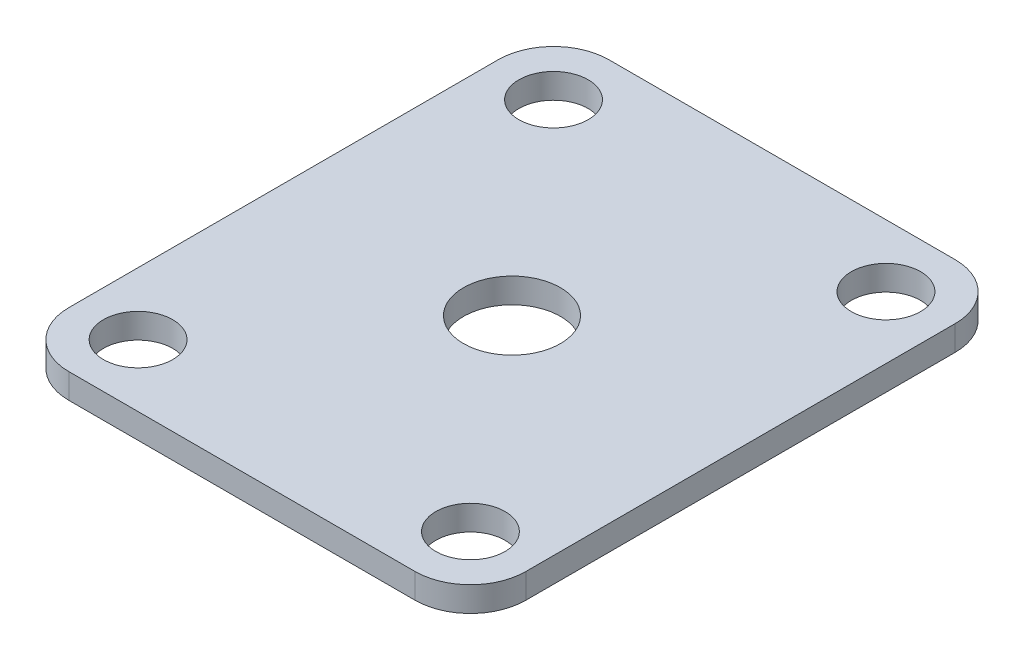
ISO-10303-21;
HEADER;
FILE_DESCRIPTION(('STEP AP214'),'2;1');
FILE_NAME('part.step','',(''),(''),'','','');
FILE_SCHEMA(('AUTOMOTIVE_DESIGN { 1 0 10303 214 1 1 1 1 }'));
ENDSEC;
DATA;
#1=APPLICATION_CONTEXT('core data for automotive mechanical design processes');
#2=APPLICATION_PROTOCOL_DEFINITION('international standard','automotive_design',2000,#1);
#3=PRODUCT_CONTEXT('',#1,'mechanical');
#4=PRODUCT('Part','Part','',(#3));
#5=PRODUCT_RELATED_PRODUCT_CATEGORY('part','',(#4));
#6=PRODUCT_DEFINITION_FORMATION('','',#4);
#7=PRODUCT_DEFINITION_CONTEXT('part definition',#1,'design');
#8=PRODUCT_DEFINITION('design','',#6,#7);
#9=PRODUCT_DEFINITION_SHAPE('','',#8);
#10=(LENGTH_UNIT() NAMED_UNIT(*) SI_UNIT(.MILLI.,.METRE.));
#11=(NAMED_UNIT(*) PLANE_ANGLE_UNIT() SI_UNIT($,.RADIAN.));
#12=(NAMED_UNIT(*) SI_UNIT($,.STERADIAN.) SOLID_ANGLE_UNIT());
#13=UNCERTAINTY_MEASURE_WITH_UNIT(LENGTH_MEASURE(1.E-05),#10,'distance_accuracy_value','');
#14=(GEOMETRIC_REPRESENTATION_CONTEXT(3) GLOBAL_UNCERTAINTY_ASSIGNED_CONTEXT((#13)) GLOBAL_UNIT_ASSIGNED_CONTEXT((#10,
#11,#12)) REPRESENTATION_CONTEXT('',''));
#15=CARTESIAN_POINT('',(0.,0.,0.));
#16=DIRECTION('',(0.,0.,1.));
#17=DIRECTION('',(1.,0.,0.));
#18=AXIS2_PLACEMENT_3D('',#15,#16,#17);
#19=CARTESIAN_POINT('',(0.,1.8,0.));
#20=DIRECTION('',(0.,1.,0.));
#21=DIRECTION('',(0.,0.,1.));
#22=AXIS2_PLACEMENT_3D('',#19,#20,#21);
#23=PLANE('',#22);
#24=CARTESIAN_POINT('',(-12.,1.8,-15.));
#25=DIRECTION('',(0.,1.,0.));
#26=DIRECTION('',(0.,0.,1.));
#27=AXIS2_PLACEMENT_3D('',#24,#25,#26);
#28=CIRCLE('',#27,2.5);
#29=CARTESIAN_POINT('',(-12.,1.8,-12.5));
#30=VERTEX_POINT('',#29);
#31=EDGE_CURVE('E192',#30,#30,#28,.T.);
#32=ORIENTED_EDGE('',*,*,#31,.F.);
#33=EDGE_LOOP('',(#32));
#34=FACE_BOUND('',#33,.T.);
#35=CARTESIAN_POINT('',(12.,1.8,-15.));
#36=DIRECTION('',(0.,1.,0.));
#37=DIRECTION('',(0.,0.,-1.));
#38=AXIS2_PLACEMENT_3D('',#35,#36,#37);
#39=CIRCLE('',#38,2.5);
#40=CARTESIAN_POINT('',(12.,1.8,-17.5));
#41=VERTEX_POINT('',#40);
#42=EDGE_CURVE('E181',#41,#41,#39,.T.);
#43=ORIENTED_EDGE('',*,*,#42,.F.);
#44=EDGE_LOOP('',(#43));
#45=FACE_BOUND('',#44,.T.);
#46=DIRECTION('',(0.,0.,1.));
#47=VECTOR('',#46,1.);
#48=CARTESIAN_POINT('',(-16.5,1.8,19.5));
#49=LINE('',#48,#47);
#50=CARTESIAN_POINT('',(-16.5,1.8,-15.5));
#51=VERTEX_POINT('',#50);
#52=CARTESIAN_POINT('',(-16.5,1.8,15.5));
#53=VERTEX_POINT('',#52);
#54=EDGE_CURVE('E109',#51,#53,#49,.T.);
#55=ORIENTED_EDGE('',*,*,#54,.T.);
#56=CARTESIAN_POINT('',(-12.5,1.8,15.5));
#57=DIRECTION('',(0.,1.,0.));
#58=DIRECTION('',(0.,0.,1.));
#59=AXIS2_PLACEMENT_3D('',#56,#57,#58);
#60=CIRCLE('',#59,4.);
#61=CARTESIAN_POINT('',(-12.5,1.8,19.5));
#62=VERTEX_POINT('',#61);
#63=EDGE_CURVE('E11',#53,#62,#60,.T.);
#64=ORIENTED_EDGE('',*,*,#63,.T.);
#65=DIRECTION('',(1.,0.,0.));
#66=VECTOR('',#65,1.);
#67=CARTESIAN_POINT('',(16.5,1.8,19.5));
#68=LINE('',#67,#66);
#69=CARTESIAN_POINT('',(12.5,1.8,19.5));
#70=VERTEX_POINT('',#69);
#71=EDGE_CURVE('E160',#62,#70,#68,.T.);
#72=ORIENTED_EDGE('',*,*,#71,.T.);
#73=CARTESIAN_POINT('',(12.5,1.8,15.5));
#74=DIRECTION('',(0.,1.,0.));
#75=DIRECTION('',(0.,0.,1.));
#76=AXIS2_PLACEMENT_3D('',#73,#74,#75);
#77=CIRCLE('',#76,4.);
#78=CARTESIAN_POINT('',(16.5,1.8,15.5));
#79=VERTEX_POINT('',#78);
#80=EDGE_CURVE('E151',#70,#79,#77,.T.);
#81=ORIENTED_EDGE('',*,*,#80,.T.);
#82=DIRECTION('',(0.,0.,-1.));
#83=VECTOR('',#82,1.);
#84=CARTESIAN_POINT('',(16.5,1.8,19.5));
#85=LINE('',#84,#83);
#86=CARTESIAN_POINT('',(16.5,1.8,-15.5));
#87=VERTEX_POINT('',#86);
#88=EDGE_CURVE('E172',#79,#87,#85,.T.);
#89=ORIENTED_EDGE('',*,*,#88,.T.);
#90=CARTESIAN_POINT('',(12.5,1.8,-15.5));
#91=DIRECTION('',(0.,1.,0.));
#92=DIRECTION('',(0.,0.,1.));
#93=AXIS2_PLACEMENT_3D('',#90,#91,#92);
#94=CIRCLE('',#93,4.);
#95=CARTESIAN_POINT('',(12.5,1.8,-19.5));
#96=VERTEX_POINT('',#95);
#97=EDGE_CURVE('E140',#87,#96,#94,.T.);
#98=ORIENTED_EDGE('',*,*,#97,.T.);
#99=DIRECTION('',(-1.,0.,0.));
#100=VECTOR('',#99,1.);
#101=CARTESIAN_POINT('',(16.5,1.8,-19.5));
#102=LINE('',#101,#100);
#103=CARTESIAN_POINT('',(-12.5,1.8,-19.5));
#104=VERTEX_POINT('',#103);
#105=EDGE_CURVE('E110',#96,#104,#102,.T.);
#106=ORIENTED_EDGE('',*,*,#105,.T.);
#107=CARTESIAN_POINT('',(-12.5,1.8,-15.5));
#108=DIRECTION('',(0.,1.,0.));
#109=DIRECTION('',(0.,0.,1.));
#110=AXIS2_PLACEMENT_3D('',#107,#108,#109);
#111=CIRCLE('',#110,4.);
#112=EDGE_CURVE('E129',#104,#51,#111,.T.);
#113=ORIENTED_EDGE('',*,*,#112,.T.);
#114=EDGE_LOOP('',(#55,#64,#72,#81,#89,#98,#106,#113));
#115=FACE_BOUND('',#114,.T.);
#116=CARTESIAN_POINT('',(12.,1.8,15.));
#117=DIRECTION('',(0.,1.,0.));
#118=DIRECTION('',(0.,0.,1.));
#119=AXIS2_PLACEMENT_3D('',#116,#117,#118);
#120=CIRCLE('',#119,2.5);
#121=CARTESIAN_POINT('',(12.,1.8,17.5));
#122=VERTEX_POINT('',#121);
#123=EDGE_CURVE('E115',#122,#122,#120,.T.);
#124=ORIENTED_EDGE('',*,*,#123,.F.);
#125=EDGE_LOOP('',(#124));
#126=FACE_BOUND('',#125,.T.);
#127=CARTESIAN_POINT('',(-12.,1.8,15.));
#128=DIRECTION('',(0.,1.,0.));
#129=DIRECTION('',(0.,0.,-1.));
#130=AXIS2_PLACEMENT_3D('',#127,#128,#129);
#131=CIRCLE('',#130,2.5);
#132=CARTESIAN_POINT('',(-12.,1.8,12.5));
#133=VERTEX_POINT('',#132);
#134=EDGE_CURVE('E186',#133,#133,#131,.T.);
#135=ORIENTED_EDGE('',*,*,#134,.F.);
#136=EDGE_LOOP('',(#135));
#137=FACE_BOUND('',#136,.T.);
#138=CARTESIAN_POINT('',(0.,1.8,0.));
#139=DIRECTION('',(0.,1.,0.));
#140=DIRECTION('',(0.,0.,1.));
#141=AXIS2_PLACEMENT_3D('',#138,#139,#140);
#142=CIRCLE('',#141,3.5);
#143=CARTESIAN_POINT('',(0.,1.8,3.5));
#144=VERTEX_POINT('',#143);
#145=EDGE_CURVE('E198',#144,#144,#142,.T.);
#146=ORIENTED_EDGE('',*,*,#145,.F.);
#147=EDGE_LOOP('',(#146));
#148=FACE_BOUND('',#147,.T.);
#149=ADVANCED_FACE('F32',(#34,#45,#115,#126,#137,#148),#23,.T.);
#150=CARTESIAN_POINT('',(0.,0.,0.));
#151=DIRECTION('',(0.,1.,0.));
#152=DIRECTION('',(0.,0.,1.));
#153=AXIS2_PLACEMENT_3D('',#150,#151,#152);
#154=PLANE('',#153);
#155=DIRECTION('',(1.,0.,0.));
#156=VECTOR('',#155,1.);
#157=CARTESIAN_POINT('',(16.5,0.,19.5));
#158=LINE('',#157,#156);
#159=CARTESIAN_POINT('',(-12.5,0.,19.5));
#160=VERTEX_POINT('',#159);
#161=CARTESIAN_POINT('',(12.5,0.,19.5));
#162=VERTEX_POINT('',#161);
#163=EDGE_CURVE('E114',#160,#162,#158,.T.);
#164=ORIENTED_EDGE('',*,*,#163,.F.);
#165=CARTESIAN_POINT('',(-12.5,0.,15.5));
#166=DIRECTION('',(0.,1.,0.));
#167=DIRECTION('',(0.,0.,1.));
#168=AXIS2_PLACEMENT_3D('',#165,#166,#167);
#169=CIRCLE('',#168,4.);
#170=CARTESIAN_POINT('',(-16.5,0.,15.5));
#171=VERTEX_POINT('',#170);
#172=EDGE_CURVE('E54',#160,#171,#169,.F.);
#173=ORIENTED_EDGE('',*,*,#172,.T.);
#174=DIRECTION('',(0.,0.,1.));
#175=VECTOR('',#174,1.);
#176=CARTESIAN_POINT('',(-16.5,0.,19.5));
#177=LINE('',#176,#175);
#178=CARTESIAN_POINT('',(-16.5,0.,-15.5));
#179=VERTEX_POINT('',#178);
#180=EDGE_CURVE('E108',#179,#171,#177,.T.);
#181=ORIENTED_EDGE('',*,*,#180,.F.);
#182=CARTESIAN_POINT('',(-12.5,0.,-15.5));
#183=DIRECTION('',(0.,1.,0.));
#184=DIRECTION('',(0.,0.,1.));
#185=AXIS2_PLACEMENT_3D('',#182,#183,#184);
#186=CIRCLE('',#185,4.);
#187=CARTESIAN_POINT('',(-12.5,0.,-19.5));
#188=VERTEX_POINT('',#187);
#189=EDGE_CURVE('E98',#179,#188,#186,.F.);
#190=ORIENTED_EDGE('',*,*,#189,.T.);
#191=DIRECTION('',(-1.,0.,0.));
#192=VECTOR('',#191,1.);
#193=CARTESIAN_POINT('',(16.5,0.,-19.5));
#194=LINE('',#193,#192);
#195=CARTESIAN_POINT('',(12.5,0.,-19.5));
#196=VERTEX_POINT('',#195);
#197=EDGE_CURVE('E126',#196,#188,#194,.T.);
#198=ORIENTED_EDGE('',*,*,#197,.F.);
#199=CARTESIAN_POINT('',(12.5,0.,-15.5));
#200=DIRECTION('',(0.,1.,0.));
#201=DIRECTION('',(0.,0.,1.));
#202=AXIS2_PLACEMENT_3D('',#199,#200,#201);
#203=CIRCLE('',#202,4.);
#204=CARTESIAN_POINT('',(16.5,0.,-15.5));
#205=VERTEX_POINT('',#204);
#206=EDGE_CURVE('E134',#196,#205,#203,.F.);
#207=ORIENTED_EDGE('',*,*,#206,.T.);
#208=DIRECTION('',(0.,0.,-1.));
#209=VECTOR('',#208,1.);
#210=CARTESIAN_POINT('',(16.5,0.,19.5));
#211=LINE('',#210,#209);
#212=CARTESIAN_POINT('',(16.5,0.,15.5));
#213=VERTEX_POINT('',#212);
#214=EDGE_CURVE('E117',#213,#205,#211,.T.);
#215=ORIENTED_EDGE('',*,*,#214,.F.);
#216=CARTESIAN_POINT('',(12.5,0.,15.5));
#217=DIRECTION('',(0.,1.,0.));
#218=DIRECTION('',(0.,0.,1.));
#219=AXIS2_PLACEMENT_3D('',#216,#217,#218);
#220=CIRCLE('',#219,4.);
#221=EDGE_CURVE('E145',#213,#162,#220,.F.);
#222=ORIENTED_EDGE('',*,*,#221,.T.);
#223=EDGE_LOOP('',(#164,#173,#181,#190,#198,#207,#215,#222));
#224=FACE_BOUND('',#223,.T.);
#225=CARTESIAN_POINT('',(12.,0.,15.));
#226=DIRECTION('',(0.,1.,0.));
#227=DIRECTION('',(0.,0.,1.));
#228=AXIS2_PLACEMENT_3D('',#225,#226,#227);
#229=CIRCLE('',#228,2.5);
#230=CARTESIAN_POINT('',(12.,0.,17.5));
#231=VERTEX_POINT('',#230);
#232=EDGE_CURVE('E120',#231,#231,#229,.T.);
#233=ORIENTED_EDGE('',*,*,#232,.T.);
#234=EDGE_LOOP('',(#233));
#235=FACE_BOUND('',#234,.T.);
#236=CARTESIAN_POINT('',(12.,0.,-15.));
#237=DIRECTION('',(0.,1.,0.));
#238=DIRECTION('',(0.,0.,-1.));
#239=AXIS2_PLACEMENT_3D('',#236,#237,#238);
#240=CIRCLE('',#239,2.5);
#241=CARTESIAN_POINT('',(12.,0.,-17.5));
#242=VERTEX_POINT('',#241);
#243=EDGE_CURVE('E183',#242,#242,#240,.T.);
#244=ORIENTED_EDGE('',*,*,#243,.T.);
#245=EDGE_LOOP('',(#244));
#246=FACE_BOUND('',#245,.T.);
#247=CARTESIAN_POINT('',(-12.,0.,15.));
#248=DIRECTION('',(0.,1.,0.));
#249=DIRECTION('',(0.,0.,-1.));
#250=AXIS2_PLACEMENT_3D('',#247,#248,#249);
#251=CIRCLE('',#250,2.5);
#252=CARTESIAN_POINT('',(-12.,0.,12.5));
#253=VERTEX_POINT('',#252);
#254=EDGE_CURVE('E189',#253,#253,#251,.T.);
#255=ORIENTED_EDGE('',*,*,#254,.T.);
#256=EDGE_LOOP('',(#255));
#257=FACE_BOUND('',#256,.T.);
#258=CARTESIAN_POINT('',(-12.,0.,-15.));
#259=DIRECTION('',(0.,1.,0.));
#260=DIRECTION('',(0.,0.,1.));
#261=AXIS2_PLACEMENT_3D('',#258,#259,#260);
#262=CIRCLE('',#261,2.5);
#263=CARTESIAN_POINT('',(-12.,0.,-12.5));
#264=VERTEX_POINT('',#263);
#265=EDGE_CURVE('E195',#264,#264,#262,.T.);
#266=ORIENTED_EDGE('',*,*,#265,.T.);
#267=EDGE_LOOP('',(#266));
#268=FACE_BOUND('',#267,.T.);
#269=CARTESIAN_POINT('',(0.,0.,0.));
#270=DIRECTION('',(0.,1.,0.));
#271=DIRECTION('',(0.,0.,1.));
#272=AXIS2_PLACEMENT_3D('',#269,#270,#271);
#273=CIRCLE('',#272,3.5);
#274=CARTESIAN_POINT('',(0.,0.,3.5));
#275=VERTEX_POINT('',#274);
#276=EDGE_CURVE('E201',#275,#275,#273,.T.);
#277=ORIENTED_EDGE('',*,*,#276,.T.);
#278=EDGE_LOOP('',(#277));
#279=FACE_BOUND('',#278,.T.);
#280=ADVANCED_FACE('F112',(#224,#235,#246,#257,#268,#279),#154,.F.);
#281=CARTESIAN_POINT('',(-16.5,1.8,19.5));
#282=DIRECTION('',(1.,0.,0.));
#283=DIRECTION('',(0.,0.,-1.));
#284=AXIS2_PLACEMENT_3D('',#281,#282,#283);
#285=PLANE('',#284);
#286=ORIENTED_EDGE('',*,*,#180,.T.);
#287=DIRECTION('',(0.,-1.,0.));
#288=VECTOR('',#287,1.);
#289=CARTESIAN_POINT('',(-16.5,1.8,15.5));
#290=LINE('',#289,#288);
#291=EDGE_CURVE('E40',#171,#53,#290,.F.);
#292=ORIENTED_EDGE('',*,*,#291,.T.);
#293=ORIENTED_EDGE('',*,*,#54,.F.);
#294=DIRECTION('',(0.,-1.,0.));
#295=VECTOR('',#294,1.);
#296=CARTESIAN_POINT('',(-16.5,1.8,-15.5));
#297=LINE('',#296,#295);
#298=EDGE_CURVE('E102',#51,#179,#297,.T.);
#299=ORIENTED_EDGE('',*,*,#298,.T.);
#300=EDGE_LOOP('',(#286,#292,#293,#299));
#301=FACE_BOUND('',#300,.T.);
#302=ADVANCED_FACE('F107',(#301),#285,.F.);
#303=CARTESIAN_POINT('',(16.5,1.8,19.5));
#304=DIRECTION('',(0.,0.,-1.));
#305=DIRECTION('',(-1.,0.,0.));
#306=AXIS2_PLACEMENT_3D('',#303,#304,#305);
#307=PLANE('',#306);
#308=ORIENTED_EDGE('',*,*,#71,.F.);
#309=DIRECTION('',(0.,-1.,0.));
#310=VECTOR('',#309,1.);
#311=CARTESIAN_POINT('',(-12.5,1.8,19.5));
#312=LINE('',#311,#310);
#313=EDGE_CURVE('E153',#62,#160,#312,.T.);
#314=ORIENTED_EDGE('',*,*,#313,.T.);
#315=ORIENTED_EDGE('',*,*,#163,.T.);
#316=DIRECTION('',(0.,-1.,0.));
#317=VECTOR('',#316,1.);
#318=CARTESIAN_POINT('',(12.5,1.8,19.5));
#319=LINE('',#318,#317);
#320=EDGE_CURVE('E148',#162,#70,#319,.F.);
#321=ORIENTED_EDGE('',*,*,#320,.T.);
#322=EDGE_LOOP('',(#308,#314,#315,#321));
#323=FACE_BOUND('',#322,.T.);
#324=ADVANCED_FACE('F159',(#323),#307,.F.);
#325=CARTESIAN_POINT('',(16.5,1.8,19.5));
#326=DIRECTION('',(-1.,0.,0.));
#327=DIRECTION('',(0.,0.,1.));
#328=AXIS2_PLACEMENT_3D('',#325,#326,#327);
#329=PLANE('',#328);
#330=ORIENTED_EDGE('',*,*,#88,.F.);
#331=DIRECTION('',(0.,-1.,0.));
#332=VECTOR('',#331,1.);
#333=CARTESIAN_POINT('',(16.5,1.8,15.5));
#334=LINE('',#333,#332);
#335=EDGE_CURVE('E142',#79,#213,#334,.T.);
#336=ORIENTED_EDGE('',*,*,#335,.T.);
#337=ORIENTED_EDGE('',*,*,#214,.T.);
#338=DIRECTION('',(0.,-1.,0.));
#339=VECTOR('',#338,1.);
#340=CARTESIAN_POINT('',(16.5,1.8,-15.5));
#341=LINE('',#340,#339);
#342=EDGE_CURVE('E137',#205,#87,#341,.F.);
#343=ORIENTED_EDGE('',*,*,#342,.T.);
#344=EDGE_LOOP('',(#330,#336,#337,#343));
#345=FACE_BOUND('',#344,.T.);
#346=ADVANCED_FACE('F174',(#345),#329,.F.);
#347=CARTESIAN_POINT('',(16.5,1.8,-19.5));
#348=DIRECTION('',(0.,0.,1.));
#349=DIRECTION('',(1.,0.,0.));
#350=AXIS2_PLACEMENT_3D('',#347,#348,#349);
#351=PLANE('',#350);
#352=ORIENTED_EDGE('',*,*,#105,.F.);
#353=DIRECTION('',(0.,-1.,0.));
#354=VECTOR('',#353,1.);
#355=CARTESIAN_POINT('',(12.5,1.8,-19.5));
#356=LINE('',#355,#354);
#357=EDGE_CURVE('E131',#96,#196,#356,.T.);
#358=ORIENTED_EDGE('',*,*,#357,.T.);
#359=ORIENTED_EDGE('',*,*,#197,.T.);
#360=DIRECTION('',(0.,-1.,0.));
#361=VECTOR('',#360,1.);
#362=CARTESIAN_POINT('',(-12.5,1.8,-19.5));
#363=LINE('',#362,#361);
#364=EDGE_CURVE('E104',#188,#104,#363,.F.);
#365=ORIENTED_EDGE('',*,*,#364,.T.);
#366=EDGE_LOOP('',(#352,#358,#359,#365));
#367=FACE_BOUND('',#366,.T.);
#368=ADVANCED_FACE('F223',(#367),#351,.F.);
#369=CARTESIAN_POINT('',(12.,1.8,15.));
#370=DIRECTION('',(0.,-1.,0.));
#371=DIRECTION('',(0.,0.,-1.));
#372=AXIS2_PLACEMENT_3D('',#369,#370,#371);
#373=CYLINDRICAL_SURFACE('',#372,2.5);
#374=ORIENTED_EDGE('',*,*,#123,.T.);
#375=EDGE_LOOP('',(#374));
#376=FACE_BOUND('',#375,.T.);
#377=ORIENTED_EDGE('',*,*,#232,.F.);
#378=EDGE_LOOP('',(#377));
#379=FACE_BOUND('',#378,.T.);
#380=ADVANCED_FACE('F220',(#376,#379),#373,.F.);
#381=CARTESIAN_POINT('',(12.,1.8,-15.));
#382=DIRECTION('',(0.,-1.,0.));
#383=DIRECTION('',(0.,0.,-1.));
#384=AXIS2_PLACEMENT_3D('',#381,#382,#383);
#385=CYLINDRICAL_SURFACE('',#384,2.5);
#386=ORIENTED_EDGE('',*,*,#42,.T.);
#387=EDGE_LOOP('',(#386));
#388=FACE_BOUND('',#387,.T.);
#389=ORIENTED_EDGE('',*,*,#243,.F.);
#390=EDGE_LOOP('',(#389));
#391=FACE_BOUND('',#390,.T.);
#392=ADVANCED_FACE('F326',(#388,#391),#385,.F.);
#393=CARTESIAN_POINT('',(-12.,1.8,15.));
#394=DIRECTION('',(0.,-1.,0.));
#395=DIRECTION('',(0.,0.,-1.));
#396=AXIS2_PLACEMENT_3D('',#393,#394,#395);
#397=CYLINDRICAL_SURFACE('',#396,2.5);
#398=ORIENTED_EDGE('',*,*,#134,.T.);
#399=EDGE_LOOP('',(#398));
#400=FACE_BOUND('',#399,.T.);
#401=ORIENTED_EDGE('',*,*,#254,.F.);
#402=EDGE_LOOP('',(#401));
#403=FACE_BOUND('',#402,.T.);
#404=ADVANCED_FACE('F316',(#400,#403),#397,.F.);
#405=CARTESIAN_POINT('',(-12.,1.8,-15.));
#406=DIRECTION('',(0.,-1.,0.));
#407=DIRECTION('',(0.,0.,-1.));
#408=AXIS2_PLACEMENT_3D('',#405,#406,#407);
#409=CYLINDRICAL_SURFACE('',#408,2.5);
#410=ORIENTED_EDGE('',*,*,#31,.T.);
#411=EDGE_LOOP('',(#410));
#412=FACE_BOUND('',#411,.T.);
#413=ORIENTED_EDGE('',*,*,#265,.F.);
#414=EDGE_LOOP('',(#413));
#415=FACE_BOUND('',#414,.T.);
#416=ADVANCED_FACE('F307',(#412,#415),#409,.F.);
#417=CARTESIAN_POINT('',(0.,1.8,0.));
#418=DIRECTION('',(0.,-1.,0.));
#419=DIRECTION('',(0.,0.,-1.));
#420=AXIS2_PLACEMENT_3D('',#417,#418,#419);
#421=CYLINDRICAL_SURFACE('',#420,3.5);
#422=ORIENTED_EDGE('',*,*,#145,.T.);
#423=EDGE_LOOP('',(#422));
#424=FACE_BOUND('',#423,.T.);
#425=ORIENTED_EDGE('',*,*,#276,.F.);
#426=EDGE_LOOP('',(#425));
#427=FACE_BOUND('',#426,.T.);
#428=ADVANCED_FACE('F207',(#424,#427),#421,.F.);
#429=CARTESIAN_POINT('',(-12.5,1.8,-15.5));
#430=DIRECTION('',(0.,-1.,0.));
#431=DIRECTION('',(0.,0.,-1.));
#432=AXIS2_PLACEMENT_3D('',#429,#430,#431);
#433=CYLINDRICAL_SURFACE('',#432,4.);
#434=ORIENTED_EDGE('',*,*,#112,.F.);
#435=ORIENTED_EDGE('',*,*,#364,.F.);
#436=ORIENTED_EDGE('',*,*,#189,.F.);
#437=ORIENTED_EDGE('',*,*,#298,.F.);
#438=EDGE_LOOP('',(#434,#435,#436,#437));
#439=FACE_BOUND('',#438,.T.);
#440=ADVANCED_FACE('F101',(#439),#433,.T.);
#441=CARTESIAN_POINT('',(12.5,1.8,-15.5));
#442=DIRECTION('',(0.,-1.,0.));
#443=DIRECTION('',(0.,0.,-1.));
#444=AXIS2_PLACEMENT_3D('',#441,#442,#443);
#445=CYLINDRICAL_SURFACE('',#444,4.);
#446=ORIENTED_EDGE('',*,*,#97,.F.);
#447=ORIENTED_EDGE('',*,*,#342,.F.);
#448=ORIENTED_EDGE('',*,*,#206,.F.);
#449=ORIENTED_EDGE('',*,*,#357,.F.);
#450=EDGE_LOOP('',(#446,#447,#448,#449));
#451=FACE_BOUND('',#450,.T.);
#452=ADVANCED_FACE('F235',(#451),#445,.T.);
#453=CARTESIAN_POINT('',(12.5,1.8,15.5));
#454=DIRECTION('',(0.,-1.,0.));
#455=DIRECTION('',(0.,0.,-1.));
#456=AXIS2_PLACEMENT_3D('',#453,#454,#455);
#457=CYLINDRICAL_SURFACE('',#456,4.);
#458=ORIENTED_EDGE('',*,*,#80,.F.);
#459=ORIENTED_EDGE('',*,*,#320,.F.);
#460=ORIENTED_EDGE('',*,*,#221,.F.);
#461=ORIENTED_EDGE('',*,*,#335,.F.);
#462=EDGE_LOOP('',(#458,#459,#460,#461));
#463=FACE_BOUND('',#462,.T.);
#464=ADVANCED_FACE('F168',(#463),#457,.T.);
#465=CARTESIAN_POINT('',(-12.5,1.8,15.5));
#466=DIRECTION('',(0.,-1.,0.));
#467=DIRECTION('',(0.,0.,-1.));
#468=AXIS2_PLACEMENT_3D('',#465,#466,#467);
#469=CYLINDRICAL_SURFACE('',#468,4.);
#470=ORIENTED_EDGE('',*,*,#63,.F.);
#471=ORIENTED_EDGE('',*,*,#291,.F.);
#472=ORIENTED_EDGE('',*,*,#172,.F.);
#473=ORIENTED_EDGE('',*,*,#313,.F.);
#474=EDGE_LOOP('',(#470,#471,#472,#473));
#475=FACE_BOUND('',#474,.T.);
#476=ADVANCED_FACE('F34',(#475),#469,.T.);
#477=CLOSED_SHELL('',(#149,#280,#302,#324,#346,#368,#380,#392,#404,#416,#428,#440,#452,#464,#476));
#478=MANIFOLD_SOLID_BREP('B2',#477);
#479=ADVANCED_BREP_SHAPE_REPRESENTATION('',(#18,#478),#14);
#480=SHAPE_DEFINITION_REPRESENTATION(#9,#479);
ENDSEC;
END-ISO-10303-21;
